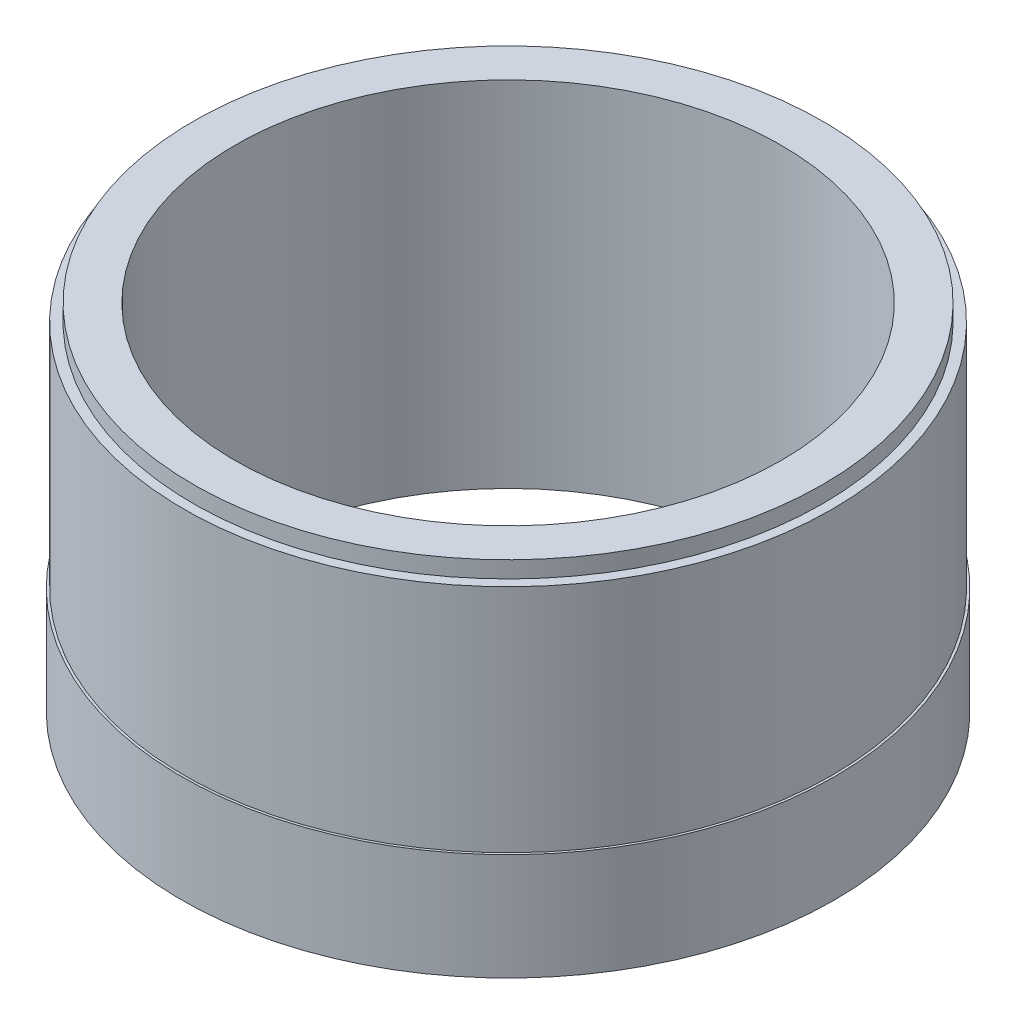
ISO-10303-21;
HEADER;
FILE_DESCRIPTION(('STEP AP214'),'2;1');
FILE_NAME('part.step','',(''),(''),'','','');
FILE_SCHEMA(('AUTOMOTIVE_DESIGN { 1 0 10303 214 1 1 1 1 }'));
ENDSEC;
DATA;
#1=APPLICATION_CONTEXT('core data for automotive mechanical design processes');
#2=APPLICATION_PROTOCOL_DEFINITION('international standard','automotive_design',2000,#1);
#3=PRODUCT_CONTEXT('',#1,'mechanical');
#4=PRODUCT('Part','Part','',(#3));
#5=PRODUCT_RELATED_PRODUCT_CATEGORY('part','',(#4));
#6=PRODUCT_DEFINITION_FORMATION('','',#4);
#7=PRODUCT_DEFINITION_CONTEXT('part definition',#1,'design');
#8=PRODUCT_DEFINITION('design','',#6,#7);
#9=PRODUCT_DEFINITION_SHAPE('','',#8);
#10=(LENGTH_UNIT() NAMED_UNIT(*) SI_UNIT(.MILLI.,.METRE.));
#11=(NAMED_UNIT(*) PLANE_ANGLE_UNIT() SI_UNIT($,.RADIAN.));
#12=(NAMED_UNIT(*) SI_UNIT($,.STERADIAN.) SOLID_ANGLE_UNIT());
#13=UNCERTAINTY_MEASURE_WITH_UNIT(LENGTH_MEASURE(1.E-05),#10,'distance_accuracy_value','');
#14=(GEOMETRIC_REPRESENTATION_CONTEXT(3) GLOBAL_UNCERTAINTY_ASSIGNED_CONTEXT((#13)) GLOBAL_UNIT_ASSIGNED_CONTEXT((#10,
#11,#12)) REPRESENTATION_CONTEXT('',''));
#15=CARTESIAN_POINT('',(0.,0.,0.));
#16=DIRECTION('',(0.,0.,1.));
#17=DIRECTION('',(1.,0.,0.));
#18=AXIS2_PLACEMENT_3D('',#15,#16,#17);
#19=CARTESIAN_POINT('',(0.,102.,0.));
#20=DIRECTION('',(0.,-1.,0.));
#21=DIRECTION('',(1.,0.,0.));
#22=AXIS2_PLACEMENT_3D('',#19,#20,#21);
#23=CYLINDRICAL_SURFACE('',#22,136.5);
#24=CARTESIAN_POINT('',(0.,50.,0.));
#25=DIRECTION('',(0.,-1.,0.));
#26=DIRECTION('',(1.,0.,0.));
#27=AXIS2_PLACEMENT_3D('',#24,#25,#26);
#28=CIRCLE('',#27,136.5);
#29=CARTESIAN_POINT('',(136.5,50.,0.));
#30=VERTEX_POINT('',#29);
#31=EDGE_CURVE('E42',#30,#30,#28,.T.);
#32=ORIENTED_EDGE('',*,*,#31,.F.);
#33=EDGE_LOOP('',(#32));
#34=FACE_BOUND('',#33,.T.);
#35=CARTESIAN_POINT('',(0.,147.,0.));
#36=DIRECTION('',(0.,-1.,0.));
#37=DIRECTION('',(1.,0.,0.));
#38=AXIS2_PLACEMENT_3D('',#35,#36,#37);
#39=CIRCLE('',#38,136.5);
#40=CARTESIAN_POINT('',(136.5,147.,0.));
#41=VERTEX_POINT('',#40);
#42=EDGE_CURVE('E20',#41,#41,#39,.T.);
#43=ORIENTED_EDGE('',*,*,#42,.T.);
#44=EDGE_LOOP('',(#43));
#45=FACE_BOUND('',#44,.T.);
#46=ADVANCED_FACE('F17',(#34,#45),#23,.T.);
#47=CARTESIAN_POINT('',(134.5,147.,0.));
#48=DIRECTION('',(0.,-1.,0.));
#49=DIRECTION('',(0.,0.,-1.));
#50=AXIS2_PLACEMENT_3D('',#47,#48,#49);
#51=PLANE('',#50);
#52=CARTESIAN_POINT('',(0.,147.,0.));
#53=DIRECTION('',(0.,-1.,0.));
#54=DIRECTION('',(1.,0.,0.));
#55=AXIS2_PLACEMENT_3D('',#52,#53,#54);
#56=CIRCLE('',#55,132.5);
#57=CARTESIAN_POINT('',(132.5,147.,0.));
#58=VERTEX_POINT('',#57);
#59=EDGE_CURVE('E47',#58,#58,#56,.F.);
#60=ORIENTED_EDGE('',*,*,#59,.F.);
#61=EDGE_LOOP('',(#60));
#62=FACE_BOUND('',#61,.T.);
#63=ORIENTED_EDGE('',*,*,#42,.F.);
#64=EDGE_LOOP('',(#63));
#65=FACE_BOUND('',#64,.T.);
#66=ADVANCED_FACE('F119',(#62,#65),#51,.F.);
#67=CARTESIAN_POINT('',(137.,50.,0.));
#68=DIRECTION('',(0.,1.,0.));
#69=DIRECTION('',(0.,0.,1.));
#70=AXIS2_PLACEMENT_3D('',#67,#68,#69);
#71=PLANE('',#70);
#72=ORIENTED_EDGE('',*,*,#31,.T.);
#73=EDGE_LOOP('',(#72));
#74=FACE_BOUND('',#73,.T.);
#75=CARTESIAN_POINT('',(0.,50.,0.));
#76=DIRECTION('',(0.,-1.,0.));
#77=DIRECTION('',(1.,0.,0.));
#78=AXIS2_PLACEMENT_3D('',#75,#76,#77);
#79=CIRCLE('',#78,137.5);
#80=CARTESIAN_POINT('',(137.5,50.,0.));
#81=VERTEX_POINT('',#80);
#82=EDGE_CURVE('E50',#81,#81,#79,.T.);
#83=ORIENTED_EDGE('',*,*,#82,.F.);
#84=EDGE_LOOP('',(#83));
#85=FACE_BOUND('',#84,.T.);
#86=ADVANCED_FACE('F77',(#74,#85),#71,.T.);
#87=CARTESIAN_POINT('',(0.,150.5,0.));
#88=DIRECTION('',(0.,-1.,0.));
#89=DIRECTION('',(1.,0.,0.));
#90=AXIS2_PLACEMENT_3D('',#87,#88,#89);
#91=CYLINDRICAL_SURFACE('',#90,132.5);
#92=ORIENTED_EDGE('',*,*,#59,.T.);
#93=EDGE_LOOP('',(#92));
#94=FACE_BOUND('',#93,.T.);
#95=CARTESIAN_POINT('',(0.,154.,0.));
#96=DIRECTION('',(0.,-1.,0.));
#97=DIRECTION('',(1.,0.,0.));
#98=AXIS2_PLACEMENT_3D('',#95,#96,#97);
#99=CIRCLE('',#98,132.5);
#100=CARTESIAN_POINT('',(132.5,154.,0.));
#101=VERTEX_POINT('',#100);
#102=EDGE_CURVE('E54',#101,#101,#99,.F.);
#103=ORIENTED_EDGE('',*,*,#102,.F.);
#104=EDGE_LOOP('',(#103));
#105=FACE_BOUND('',#104,.T.);
#106=ADVANCED_FACE('F68',(#94,#105),#91,.T.);
#107=CARTESIAN_POINT('',(0.,27.5,0.));
#108=DIRECTION('',(0.,-1.,0.));
#109=DIRECTION('',(1.,0.,0.));
#110=AXIS2_PLACEMENT_3D('',#107,#108,#109);
#111=CYLINDRICAL_SURFACE('',#110,137.5);
#112=ORIENTED_EDGE('',*,*,#82,.T.);
#113=EDGE_LOOP('',(#112));
#114=FACE_BOUND('',#113,.T.);
#115=CARTESIAN_POINT('',(0.,5.,0.));
#116=DIRECTION('',(0.,-1.,0.));
#117=DIRECTION('',(1.,0.,0.));
#118=AXIS2_PLACEMENT_3D('',#115,#116,#117);
#119=CIRCLE('',#118,137.5);
#120=CARTESIAN_POINT('',(137.5,5.,0.));
#121=VERTEX_POINT('',#120);
#122=EDGE_CURVE('E33',#121,#121,#119,.T.);
#123=ORIENTED_EDGE('',*,*,#122,.F.);
#124=EDGE_LOOP('',(#123));
#125=FACE_BOUND('',#124,.T.);
#126=ADVANCED_FACE('F65',(#114,#125),#111,.T.);
#127=CARTESIAN_POINT('',(125.75,154.,0.));
#128=DIRECTION('',(0.,1.,0.));
#129=DIRECTION('',(0.,0.,1.));
#130=AXIS2_PLACEMENT_3D('',#127,#128,#129);
#131=PLANE('',#130);
#132=CARTESIAN_POINT('',(0.,154.,0.));
#133=DIRECTION('',(0.,-1.,0.));
#134=DIRECTION('',(1.,0.,0.));
#135=AXIS2_PLACEMENT_3D('',#132,#133,#134);
#136=CIRCLE('',#135,115.);
#137=CARTESIAN_POINT('',(115.,154.,0.));
#138=VERTEX_POINT('',#137);
#139=EDGE_CURVE('E26',#138,#138,#136,.T.);
#140=ORIENTED_EDGE('',*,*,#139,.T.);
#141=EDGE_LOOP('',(#140));
#142=FACE_BOUND('',#141,.T.);
#143=ORIENTED_EDGE('',*,*,#102,.T.);
#144=EDGE_LOOP('',(#143));
#145=FACE_BOUND('',#144,.T.);
#146=ADVANCED_FACE('F67',(#142,#145),#131,.T.);
#147=CARTESIAN_POINT('',(126.25,5.,0.));
#148=DIRECTION('',(0.,-1.,0.));
#149=DIRECTION('',(0.,0.,-1.));
#150=AXIS2_PLACEMENT_3D('',#147,#148,#149);
#151=PLANE('',#150);
#152=CARTESIAN_POINT('',(0.,5.,0.));
#153=DIRECTION('',(0.,-1.,0.));
#154=DIRECTION('',(1.,0.,0.));
#155=AXIS2_PLACEMENT_3D('',#152,#153,#154);
#156=CIRCLE('',#155,115.);
#157=CARTESIAN_POINT('',(115.,5.,0.));
#158=VERTEX_POINT('',#157);
#159=EDGE_CURVE('E11',#158,#158,#156,.F.);
#160=ORIENTED_EDGE('',*,*,#159,.T.);
#161=EDGE_LOOP('',(#160));
#162=FACE_BOUND('',#161,.T.);
#163=ORIENTED_EDGE('',*,*,#122,.T.);
#164=EDGE_LOOP('',(#163));
#165=FACE_BOUND('',#164,.T.);
#166=ADVANCED_FACE('F63',(#162,#165),#151,.T.);
#167=CARTESIAN_POINT('',(0.,79.5,0.));
#168=DIRECTION('',(0.,-1.,0.));
#169=DIRECTION('',(1.,0.,0.));
#170=AXIS2_PLACEMENT_3D('',#167,#168,#169);
#171=CYLINDRICAL_SURFACE('',#170,115.);
#172=ORIENTED_EDGE('',*,*,#159,.F.);
#173=EDGE_LOOP('',(#172));
#174=FACE_BOUND('',#173,.T.);
#175=ORIENTED_EDGE('',*,*,#139,.F.);
#176=EDGE_LOOP('',(#175));
#177=FACE_BOUND('',#176,.T.);
#178=ADVANCED_FACE('F80',(#174,#177),#171,.F.);
#179=CLOSED_SHELL('',(#46,#66,#86,#106,#126,#146,#166,#178));
#180=MANIFOLD_SOLID_BREP('B1',#179);
#181=ADVANCED_BREP_SHAPE_REPRESENTATION('',(#18,#180),#14);
#182=SHAPE_DEFINITION_REPRESENTATION(#9,#181);
ENDSEC;
END-ISO-10303-21;
